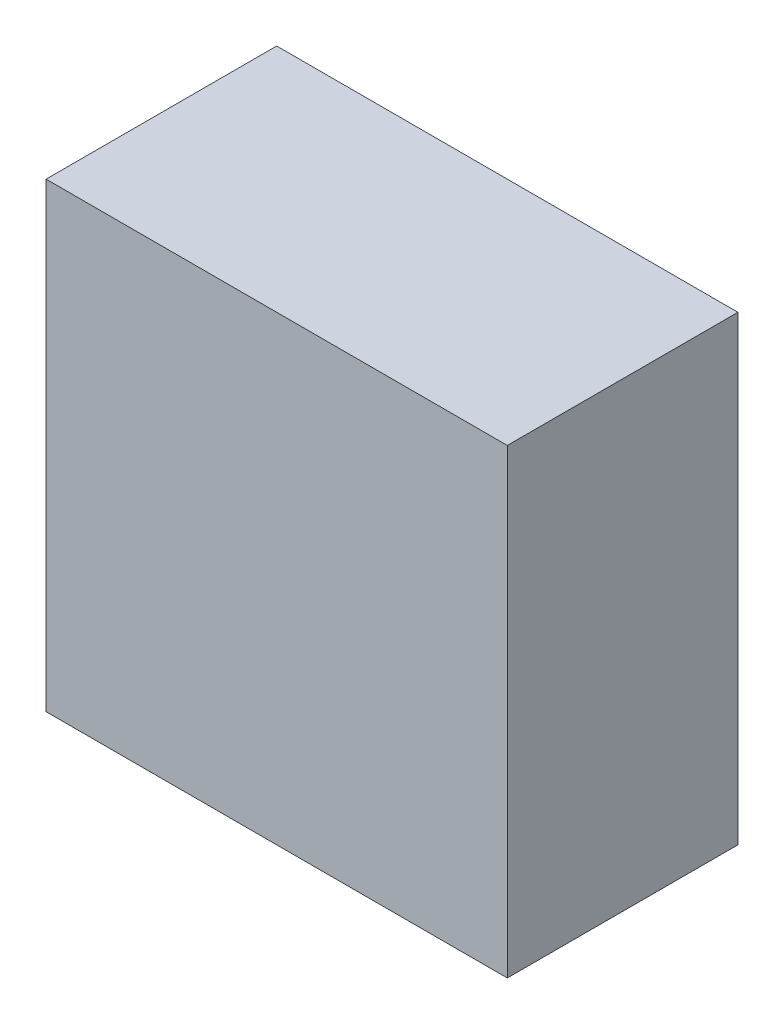
ISO-10303-21;
HEADER;
FILE_DESCRIPTION(('STEP AP214'),'2;1');
FILE_NAME('part.step','',(''),(''),'','','');
FILE_SCHEMA(('AUTOMOTIVE_DESIGN { 1 0 10303 214 1 1 1 1 }'));
ENDSEC;
DATA;
#1=APPLICATION_CONTEXT('core data for automotive mechanical design processes');
#2=APPLICATION_PROTOCOL_DEFINITION('international standard','automotive_design',2000,#1);
#3=PRODUCT_CONTEXT('',#1,'mechanical');
#4=PRODUCT('Part','Part','',(#3));
#5=PRODUCT_RELATED_PRODUCT_CATEGORY('part','',(#4));
#6=PRODUCT_DEFINITION_FORMATION('','',#4);
#7=PRODUCT_DEFINITION_CONTEXT('part definition',#1,'design');
#8=PRODUCT_DEFINITION('design','',#6,#7);
#9=PRODUCT_DEFINITION_SHAPE('','',#8);
#10=(LENGTH_UNIT() NAMED_UNIT(*) SI_UNIT(.MILLI.,.METRE.));
#11=(NAMED_UNIT(*) PLANE_ANGLE_UNIT() SI_UNIT($,.RADIAN.));
#12=(NAMED_UNIT(*) SI_UNIT($,.STERADIAN.) SOLID_ANGLE_UNIT());
#13=UNCERTAINTY_MEASURE_WITH_UNIT(LENGTH_MEASURE(1.E-05),#10,'distance_accuracy_value','');
#14=(GEOMETRIC_REPRESENTATION_CONTEXT(3) GLOBAL_UNCERTAINTY_ASSIGNED_CONTEXT((#13)) GLOBAL_UNIT_ASSIGNED_CONTEXT((#10,
#11,#12)) REPRESENTATION_CONTEXT('',''));
#15=CARTESIAN_POINT('',(0.,0.,0.));
#16=DIRECTION('',(0.,0.,1.));
#17=DIRECTION('',(1.,0.,0.));
#18=AXIS2_PLACEMENT_3D('',#15,#16,#17);
#19=CARTESIAN_POINT('',(-107.865168539326,91.5730337078652,100.));
#20=DIRECTION('',(1.,0.,0.));
#21=DIRECTION('',(0.,1.,0.));
#22=AXIS2_PLACEMENT_3D('',#19,#20,#21);
#23=PLANE('',#22);
#24=DIRECTION('',(0.,-1.,0.));
#25=VECTOR('',#24,1.);
#26=CARTESIAN_POINT('',(-107.865168539326,91.5730337078652,0.));
#27=LINE('',#26,#25);
#28=CARTESIAN_POINT('',(-107.865168539326,91.5730337078652,0.));
#29=VERTEX_POINT('',#28);
#30=CARTESIAN_POINT('',(-107.865168539326,-108.426966292135,0.));
#31=VERTEX_POINT('',#30);
#32=EDGE_CURVE('E100',#29,#31,#27,.T.);
#33=ORIENTED_EDGE('',*,*,#32,.T.);
#34=DIRECTION('',(0.,0.,-1.));
#35=VECTOR('',#34,1.);
#36=CARTESIAN_POINT('',(-107.865168539326,-108.426966292135,100.));
#37=LINE('',#36,#35);
#38=CARTESIAN_POINT('',(-107.865168539326,-108.426966292135,100.));
#39=VERTEX_POINT('',#38);
#40=EDGE_CURVE('E11',#39,#31,#37,.T.);
#41=ORIENTED_EDGE('',*,*,#40,.F.);
#42=DIRECTION('',(0.,-1.,0.));
#43=VECTOR('',#42,1.);
#44=CARTESIAN_POINT('',(-107.865168539326,91.5730337078652,100.));
#45=LINE('',#44,#43);
#46=CARTESIAN_POINT('',(-107.865168539326,91.5730337078652,100.));
#47=VERTEX_POINT('',#46);
#48=EDGE_CURVE('E88',#47,#39,#45,.T.);
#49=ORIENTED_EDGE('',*,*,#48,.F.);
#50=DIRECTION('',(0.,0.,-1.));
#51=VECTOR('',#50,1.);
#52=CARTESIAN_POINT('',(-107.865168539326,91.5730337078652,100.));
#53=LINE('',#52,#51);
#54=EDGE_CURVE('E96',#47,#29,#53,.T.);
#55=ORIENTED_EDGE('',*,*,#54,.T.);
#56=EDGE_LOOP('',(#33,#41,#49,#55));
#57=FACE_BOUND('',#56,.T.);
#58=ADVANCED_FACE('F37',(#57),#23,.F.);
#59=CARTESIAN_POINT('',(-107.865168539326,-108.426966292135,100.));
#60=DIRECTION('',(0.,1.,0.));
#61=DIRECTION('',(0.,0.,1.));
#62=AXIS2_PLACEMENT_3D('',#59,#60,#61);
#63=PLANE('',#62);
#64=DIRECTION('',(1.,0.,0.));
#65=VECTOR('',#64,1.);
#66=CARTESIAN_POINT('',(-107.865168539326,-108.426966292135,0.));
#67=LINE('',#66,#65);
#68=CARTESIAN_POINT('',(92.1348314606742,-108.426966292135,0.));
#69=VERTEX_POINT('',#68);
#70=EDGE_CURVE('E92',#31,#69,#67,.T.);
#71=ORIENTED_EDGE('',*,*,#70,.T.);
#72=DIRECTION('',(0.,0.,-1.));
#73=VECTOR('',#72,1.);
#74=CARTESIAN_POINT('',(92.1348314606742,-108.426966292135,100.));
#75=LINE('',#74,#73);
#76=CARTESIAN_POINT('',(92.1348314606742,-108.426966292135,100.));
#77=VERTEX_POINT('',#76);
#78=EDGE_CURVE('E45',#77,#69,#75,.T.);
#79=ORIENTED_EDGE('',*,*,#78,.F.);
#80=DIRECTION('',(1.,0.,0.));
#81=VECTOR('',#80,1.);
#82=CARTESIAN_POINT('',(-107.865168539326,-108.426966292135,100.));
#83=LINE('',#82,#81);
#84=EDGE_CURVE('E83',#39,#77,#83,.T.);
#85=ORIENTED_EDGE('',*,*,#84,.F.);
#86=ORIENTED_EDGE('',*,*,#40,.T.);
#87=EDGE_LOOP('',(#71,#79,#85,#86));
#88=FACE_BOUND('',#87,.T.);
#89=ADVANCED_FACE('F91',(#88),#63,.F.);
#90=CARTESIAN_POINT('',(92.1348314606742,91.5730337078652,100.));
#91=DIRECTION('',(-1.,0.,0.));
#92=DIRECTION('',(0.,-1.,0.));
#93=AXIS2_PLACEMENT_3D('',#90,#91,#92);
#94=PLANE('',#93);
#95=DIRECTION('',(0.,1.,0.));
#96=VECTOR('',#95,1.);
#97=CARTESIAN_POINT('',(92.1348314606742,91.5730337078652,0.));
#98=LINE('',#97,#96);
#99=CARTESIAN_POINT('',(92.1348314606742,91.5730337078652,0.));
#100=VERTEX_POINT('',#99);
#101=EDGE_CURVE('E70',#69,#100,#98,.T.);
#102=ORIENTED_EDGE('',*,*,#101,.T.);
#103=DIRECTION('',(0.,0.,-1.));
#104=VECTOR('',#103,1.);
#105=CARTESIAN_POINT('',(92.1348314606742,91.5730337078652,100.));
#106=LINE('',#105,#104);
#107=CARTESIAN_POINT('',(92.1348314606742,91.5730337078652,100.));
#108=VERTEX_POINT('',#107);
#109=EDGE_CURVE('E93',#108,#100,#106,.T.);
#110=ORIENTED_EDGE('',*,*,#109,.F.);
#111=DIRECTION('',(0.,1.,0.));
#112=VECTOR('',#111,1.);
#113=CARTESIAN_POINT('',(92.1348314606742,91.5730337078652,100.));
#114=LINE('',#113,#112);
#115=EDGE_CURVE('E86',#77,#108,#114,.T.);
#116=ORIENTED_EDGE('',*,*,#115,.F.);
#117=ORIENTED_EDGE('',*,*,#78,.T.);
#118=EDGE_LOOP('',(#102,#110,#116,#117));
#119=FACE_BOUND('',#118,.T.);
#120=ADVANCED_FACE('F94',(#119),#94,.F.);
#121=CARTESIAN_POINT('',(-107.865168539326,91.5730337078652,100.));
#122=DIRECTION('',(0.,-1.,0.));
#123=DIRECTION('',(0.,0.,-1.));
#124=AXIS2_PLACEMENT_3D('',#121,#122,#123);
#125=PLANE('',#124);
#126=DIRECTION('',(-1.,0.,0.));
#127=VECTOR('',#126,1.);
#128=CARTESIAN_POINT('',(-107.865168539326,91.5730337078652,0.));
#129=LINE('',#128,#127);
#130=EDGE_CURVE('E76',#100,#29,#129,.T.);
#131=ORIENTED_EDGE('',*,*,#130,.T.);
#132=ORIENTED_EDGE('',*,*,#54,.F.);
#133=DIRECTION('',(-1.,0.,0.));
#134=VECTOR('',#133,1.);
#135=CARTESIAN_POINT('',(-107.865168539326,91.5730337078652,100.));
#136=LINE('',#135,#134);
#137=EDGE_CURVE('E53',#108,#47,#136,.T.);
#138=ORIENTED_EDGE('',*,*,#137,.F.);
#139=ORIENTED_EDGE('',*,*,#109,.T.);
#140=EDGE_LOOP('',(#131,#132,#138,#139));
#141=FACE_BOUND('',#140,.T.);
#142=ADVANCED_FACE('F107',(#141),#125,.F.);
#143=CARTESIAN_POINT('',(0.,0.,100.));
#144=DIRECTION('',(0.,0.,1.));
#145=DIRECTION('',(1.,0.,0.));
#146=AXIS2_PLACEMENT_3D('',#143,#144,#145);
#147=PLANE('',#146);
#148=ORIENTED_EDGE('',*,*,#48,.T.);
#149=ORIENTED_EDGE('',*,*,#84,.T.);
#150=ORIENTED_EDGE('',*,*,#115,.T.);
#151=ORIENTED_EDGE('',*,*,#137,.T.);
#152=EDGE_LOOP('',(#148,#149,#150,#151));
#153=FACE_BOUND('',#152,.T.);
#154=ADVANCED_FACE('F84',(#153),#147,.T.);
#155=CARTESIAN_POINT('',(0.,0.,0.));
#156=DIRECTION('',(0.,0.,1.));
#157=DIRECTION('',(1.,0.,0.));
#158=AXIS2_PLACEMENT_3D('',#155,#156,#157);
#159=PLANE('',#158);
#160=ORIENTED_EDGE('',*,*,#32,.F.);
#161=ORIENTED_EDGE('',*,*,#130,.F.);
#162=ORIENTED_EDGE('',*,*,#101,.F.);
#163=ORIENTED_EDGE('',*,*,#70,.F.);
#164=EDGE_LOOP('',(#160,#161,#162,#163));
#165=FACE_BOUND('',#164,.T.);
#166=ADVANCED_FACE('F110',(#165),#159,.F.);
#167=CLOSED_SHELL('',(#58,#89,#120,#142,#154,#166));
#168=MANIFOLD_SOLID_BREP('B2',#167);
#169=ADVANCED_BREP_SHAPE_REPRESENTATION('',(#18,#168),#14);
#170=SHAPE_DEFINITION_REPRESENTATION(#9,#169);
ENDSEC;
END-ISO-10303-21;
